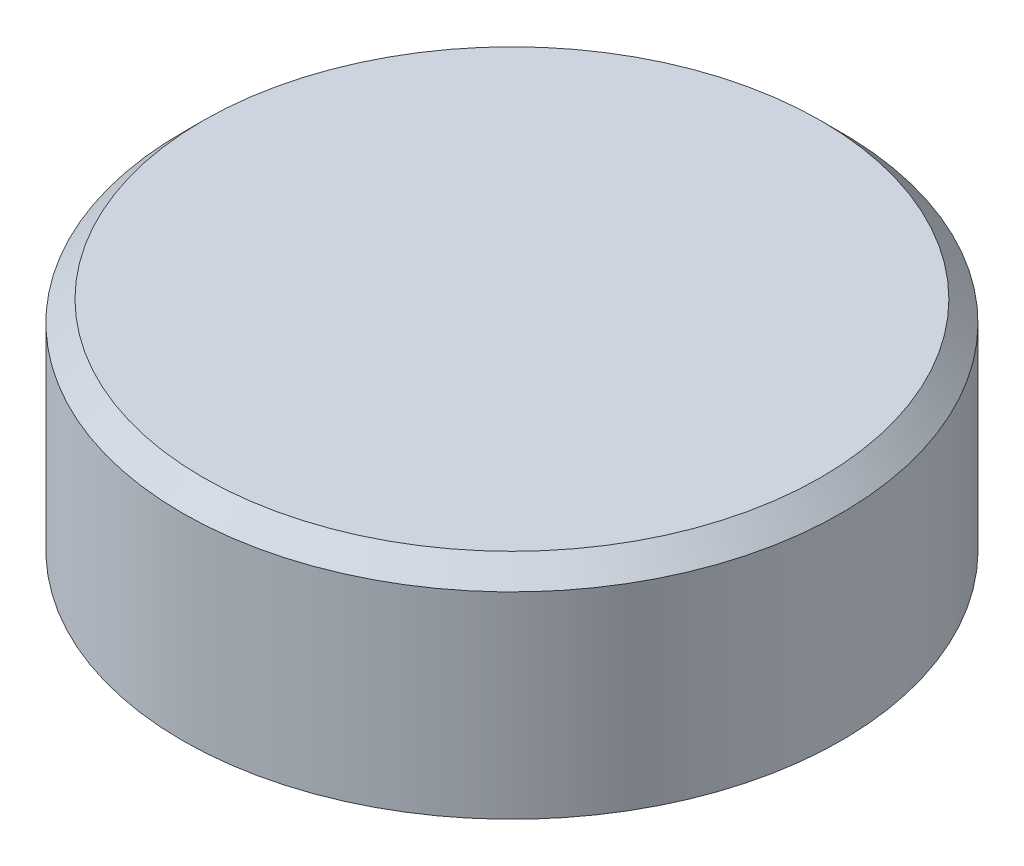
ISO-10303-21;
HEADER;
FILE_DESCRIPTION(('STEP AP214'),'2;1');
FILE_NAME('part.step','',(''),(''),'','','');
FILE_SCHEMA(('AUTOMOTIVE_DESIGN { 1 0 10303 214 1 1 1 1 }'));
ENDSEC;
DATA;
#1=APPLICATION_CONTEXT('core data for automotive mechanical design processes');
#2=APPLICATION_PROTOCOL_DEFINITION('international standard','automotive_design',2000,#1);
#3=PRODUCT_CONTEXT('',#1,'mechanical');
#4=PRODUCT('Part','Part','',(#3));
#5=PRODUCT_RELATED_PRODUCT_CATEGORY('part','',(#4));
#6=PRODUCT_DEFINITION_FORMATION('','',#4);
#7=PRODUCT_DEFINITION_CONTEXT('part definition',#1,'design');
#8=PRODUCT_DEFINITION('design','',#6,#7);
#9=PRODUCT_DEFINITION_SHAPE('','',#8);
#10=(LENGTH_UNIT() NAMED_UNIT(*) SI_UNIT(.MILLI.,.METRE.));
#11=(NAMED_UNIT(*) PLANE_ANGLE_UNIT() SI_UNIT($,.RADIAN.));
#12=(NAMED_UNIT(*) SI_UNIT($,.STERADIAN.) SOLID_ANGLE_UNIT());
#13=UNCERTAINTY_MEASURE_WITH_UNIT(LENGTH_MEASURE(1.E-05),#10,'distance_accuracy_value','');
#14=(GEOMETRIC_REPRESENTATION_CONTEXT(3) GLOBAL_UNCERTAINTY_ASSIGNED_CONTEXT((#13)) GLOBAL_UNIT_ASSIGNED_CONTEXT((#10,
#11,#12)) REPRESENTATION_CONTEXT('',''));
#15=CARTESIAN_POINT('',(0.,0.,0.));
#16=DIRECTION('',(0.,0.,1.));
#17=DIRECTION('',(1.,0.,0.));
#18=AXIS2_PLACEMENT_3D('',#15,#16,#17);
#19=CARTESIAN_POINT('',(0.,0.,0.));
#20=DIRECTION('',(0.,1.,0.));
#21=DIRECTION('',(0.,0.,1.));
#22=AXIS2_PLACEMENT_3D('',#19,#20,#21);
#23=PLANE('',#22);
#24=CARTESIAN_POINT('',(0.,0.,0.));
#25=DIRECTION('',(0.,1.,0.));
#26=DIRECTION('',(0.,0.,1.));
#27=AXIS2_PLACEMENT_3D('',#24,#25,#26);
#28=CIRCLE('',#27,4.925);
#29=CARTESIAN_POINT('',(0.,0.,4.925));
#30=VERTEX_POINT('',#29);
#31=EDGE_CURVE('E98',#30,#30,#28,.T.);
#32=ORIENTED_EDGE('',*,*,#31,.F.);
#33=EDGE_LOOP('',(#32));
#34=FACE_BOUND('',#33,.T.);
#35=CARTESIAN_POINT('',(0.,0.,0.));
#36=DIRECTION('',(0.,1.,0.));
#37=DIRECTION('',(0.,0.,1.));
#38=AXIS2_PLACEMENT_3D('',#35,#36,#37);
#39=CIRCLE('',#38,3.075);
#40=CARTESIAN_POINT('',(2.59482658380093,0.,1.65));
#41=VERTEX_POINT('',#40);
#42=CARTESIAN_POINT('',(-2.59482658380093,0.,1.65));
#43=VERTEX_POINT('',#42);
#44=EDGE_CURVE('E58',#41,#43,#39,.T.);
#45=ORIENTED_EDGE('',*,*,#44,.T.);
#46=DIRECTION('',(1.,0.,0.));
#47=VECTOR('',#46,1.);
#48=CARTESIAN_POINT('',(-2.59482658380093,0.,1.65));
#49=LINE('',#48,#47);
#50=EDGE_CURVE('E65',#43,#41,#49,.T.);
#51=ORIENTED_EDGE('',*,*,#50,.T.);
#52=EDGE_LOOP('',(#45,#51));
#53=FACE_BOUND('',#52,.T.);
#54=ADVANCED_FACE('F41',(#34,#53),#23,.F.);
#55=CARTESIAN_POINT('',(0.,7.5,0.));
#56=DIRECTION('',(0.,-1.,0.));
#57=DIRECTION('',(0.,0.,-1.));
#58=AXIS2_PLACEMENT_3D('',#55,#56,#57);
#59=CYLINDRICAL_SURFACE('',#58,4.925);
#60=CARTESIAN_POINT('',(0.,7.5,0.));
#61=DIRECTION('',(0.,1.,0.));
#62=DIRECTION('',(0.,0.,1.));
#63=AXIS2_PLACEMENT_3D('',#60,#61,#62);
#64=CIRCLE('',#63,4.925);
#65=CARTESIAN_POINT('',(0.,7.5,4.925));
#66=VERTEX_POINT('',#65);
#67=EDGE_CURVE('E99',#66,#66,#64,.T.);
#68=ORIENTED_EDGE('',*,*,#67,.F.);
#69=EDGE_LOOP('',(#68));
#70=FACE_BOUND('',#69,.T.);
#71=ORIENTED_EDGE('',*,*,#31,.T.);
#72=EDGE_LOOP('',(#71));
#73=FACE_BOUND('',#72,.T.);
#74=ADVANCED_FACE('F120',(#70,#73),#59,.T.);
#75=CARTESIAN_POINT('',(0.,7.5,0.));
#76=DIRECTION('',(0.,-1.,0.));
#77=DIRECTION('',(0.,0.,-1.));
#78=AXIS2_PLACEMENT_3D('',#75,#76,#77);
#79=CYLINDRICAL_SURFACE('',#78,3.075);
#80=ORIENTED_EDGE('',*,*,#44,.F.);
#81=DIRECTION('',(0.,-1.,0.));
#82=VECTOR('',#81,1.);
#83=CARTESIAN_POINT('',(2.59482658380093,7.5,1.65));
#84=LINE('',#83,#82);
#85=CARTESIAN_POINT('',(2.59482658380093,10.,1.65));
#86=VERTEX_POINT('',#85);
#87=EDGE_CURVE('E70',#86,#41,#84,.T.);
#88=ORIENTED_EDGE('',*,*,#87,.F.);
#89=CARTESIAN_POINT('',(0.,10.,0.));
#90=DIRECTION('',(0.,-1.,0.));
#91=DIRECTION('',(0.,0.,-1.));
#92=AXIS2_PLACEMENT_3D('',#89,#90,#91);
#93=CIRCLE('',#92,3.075);
#94=CARTESIAN_POINT('',(-2.59482658380093,10.,1.65));
#95=VERTEX_POINT('',#94);
#96=EDGE_CURVE('E73',#95,#86,#93,.T.);
#97=ORIENTED_EDGE('',*,*,#96,.F.);
#98=DIRECTION('',(0.,-1.,0.));
#99=VECTOR('',#98,1.);
#100=CARTESIAN_POINT('',(-2.59482658380093,7.5,1.65));
#101=LINE('',#100,#99);
#102=EDGE_CURVE('E77',#95,#43,#101,.T.);
#103=ORIENTED_EDGE('',*,*,#102,.T.);
#104=EDGE_LOOP('',(#80,#88,#97,#103));
#105=FACE_BOUND('',#104,.T.);
#106=ADVANCED_FACE('F72',(#105),#79,.F.);
#107=CARTESIAN_POINT('',(-2.59482658380093,7.5,1.65));
#108=DIRECTION('',(0.,0.,-1.));
#109=DIRECTION('',(-1.,0.,0.));
#110=AXIS2_PLACEMENT_3D('',#107,#108,#109);
#111=PLANE('',#110);
#112=ORIENTED_EDGE('',*,*,#50,.F.);
#113=ORIENTED_EDGE('',*,*,#102,.F.);
#114=DIRECTION('',(-1.,0.,0.));
#115=VECTOR('',#114,1.);
#116=CARTESIAN_POINT('',(2.59482658380093,10.,1.65));
#117=LINE('',#116,#115);
#118=EDGE_CURVE('E81',#86,#95,#117,.T.);
#119=ORIENTED_EDGE('',*,*,#118,.F.);
#120=ORIENTED_EDGE('',*,*,#87,.T.);
#121=EDGE_LOOP('',(#112,#113,#119,#120));
#122=FACE_BOUND('',#121,.T.);
#123=ADVANCED_FACE('F84',(#122),#111,.T.);
#124=CARTESIAN_POINT('',(0.,18.06,0.));
#125=DIRECTION('',(0.,-1.,0.));
#126=DIRECTION('',(0.,0.,-1.));
#127=AXIS2_PLACEMENT_3D('',#124,#125,#126);
#128=CYLINDRICAL_SURFACE('',#127,16.);
#129=CARTESIAN_POINT('',(0.,17.06,0.));
#130=DIRECTION('',(0.,1.,0.));
#131=DIRECTION('',(0.,0.,1.));
#132=AXIS2_PLACEMENT_3D('',#129,#130,#131);
#133=CIRCLE('',#132,16.);
#134=CARTESIAN_POINT('',(0.,17.06,16.));
#135=VERTEX_POINT('',#134);
#136=EDGE_CURVE('E11',#135,#135,#133,.F.);
#137=ORIENTED_EDGE('',*,*,#136,.T.);
#138=EDGE_LOOP('',(#137));
#139=FACE_BOUND('',#138,.T.);
#140=CARTESIAN_POINT('',(0.,7.5,0.));
#141=DIRECTION('',(0.,1.,0.));
#142=DIRECTION('',(0.,0.,1.));
#143=AXIS2_PLACEMENT_3D('',#140,#141,#142);
#144=CIRCLE('',#143,16.);
#145=CARTESIAN_POINT('',(0.,7.5,16.));
#146=VERTEX_POINT('',#145);
#147=EDGE_CURVE('E86',#146,#146,#144,.T.);
#148=ORIENTED_EDGE('',*,*,#147,.T.);
#149=EDGE_LOOP('',(#148));
#150=FACE_BOUND('',#149,.T.);
#151=ADVANCED_FACE('F134',(#139,#150),#128,.T.);
#152=CARTESIAN_POINT('',(0.,18.06,0.));
#153=DIRECTION('',(0.,1.,0.));
#154=DIRECTION('',(0.,0.,1.));
#155=AXIS2_PLACEMENT_3D('',#152,#153,#154);
#156=PLANE('',#155);
#157=CARTESIAN_POINT('',(0.,18.06,0.));
#158=DIRECTION('',(0.,1.,0.));
#159=DIRECTION('',(0.,0.,1.));
#160=AXIS2_PLACEMENT_3D('',#157,#158,#159);
#161=CIRCLE('',#160,15.);
#162=CARTESIAN_POINT('',(0.,18.06,15.));
#163=VERTEX_POINT('',#162);
#164=EDGE_CURVE('E51',#163,#163,#161,.T.);
#165=ORIENTED_EDGE('',*,*,#164,.T.);
#166=EDGE_LOOP('',(#165));
#167=FACE_BOUND('',#166,.T.);
#168=ADVANCED_FACE('F109',(#167),#156,.T.);
#169=CARTESIAN_POINT('',(0.,7.5,0.));
#170=DIRECTION('',(0.,1.,0.));
#171=DIRECTION('',(0.,0.,1.));
#172=AXIS2_PLACEMENT_3D('',#169,#170,#171);
#173=PLANE('',#172);
#174=ORIENTED_EDGE('',*,*,#67,.T.);
#175=EDGE_LOOP('',(#174));
#176=FACE_BOUND('',#175,.T.);
#177=ORIENTED_EDGE('',*,*,#147,.F.);
#178=EDGE_LOOP('',(#177));
#179=FACE_BOUND('',#178,.T.);
#180=ADVANCED_FACE('F116',(#176,#179),#173,.F.);
#181=CARTESIAN_POINT('',(0.,10.,0.));
#182=DIRECTION('',(0.,-1.,0.));
#183=DIRECTION('',(0.,0.,-1.));
#184=AXIS2_PLACEMENT_3D('',#181,#182,#183);
#185=PLANE('',#184);
#186=ORIENTED_EDGE('',*,*,#96,.T.);
#187=ORIENTED_EDGE('',*,*,#118,.T.);
#188=EDGE_LOOP('',(#186,#187));
#189=FACE_BOUND('',#188,.T.);
#190=ADVANCED_FACE('F80',(#189),#185,.T.);
#191=CARTESIAN_POINT('',(0.,18.06,0.));
#192=DIRECTION('',(0.,-1.,0.));
#193=DIRECTION('',(0.,0.,-1.));
#194=AXIS2_PLACEMENT_3D('',#191,#192,#193);
#195=CONICAL_SURFACE('',#194,15.,0.785398163397445);
#196=ORIENTED_EDGE('',*,*,#136,.F.);
#197=EDGE_LOOP('',(#196));
#198=FACE_BOUND('',#197,.T.);
#199=ORIENTED_EDGE('',*,*,#164,.F.);
#200=EDGE_LOOP('',(#199));
#201=FACE_BOUND('',#200,.T.);
#202=ADVANCED_FACE('F44',(#198,#201),#195,.T.);
#203=CLOSED_SHELL('',(#54,#74,#106,#123,#151,#168,#180,#190,#202));
#204=MANIFOLD_SOLID_BREP('B2',#203);
#205=ADVANCED_BREP_SHAPE_REPRESENTATION('',(#18,#204),#14);
#206=SHAPE_DEFINITION_REPRESENTATION(#9,#205);
ENDSEC;
END-ISO-10303-21;
